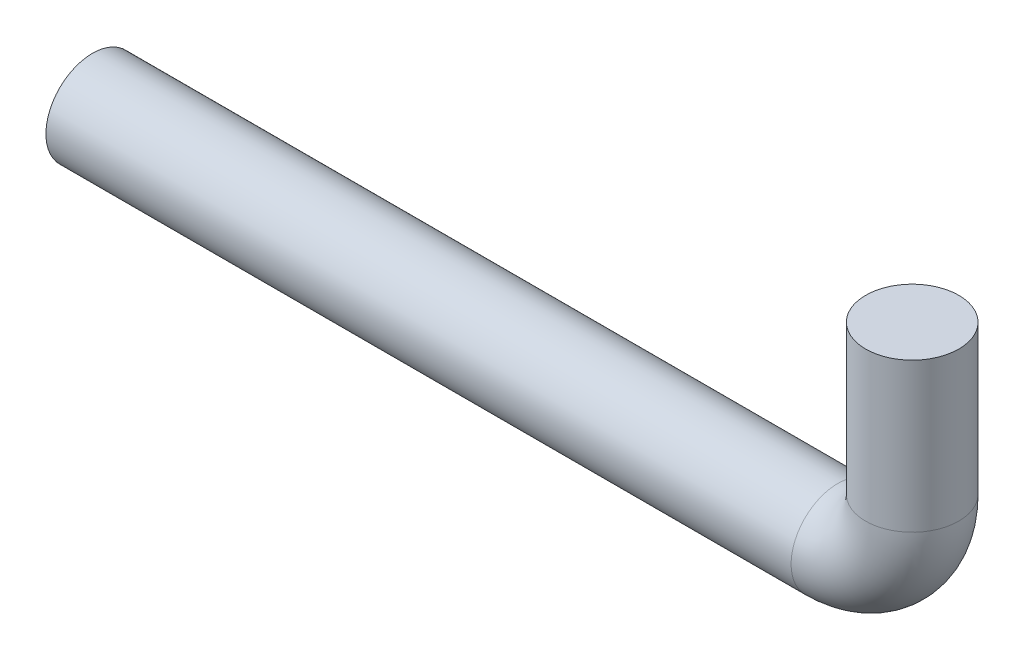
ISO-10303-21;
HEADER;
FILE_DESCRIPTION(('STEP AP214'),'2;1');
FILE_NAME('part.step','',(''),(''),'','','');
FILE_SCHEMA(('AUTOMOTIVE_DESIGN { 1 0 10303 214 1 1 1 1 }'));
ENDSEC;
DATA;
#1=APPLICATION_CONTEXT('core data for automotive mechanical design processes');
#2=APPLICATION_PROTOCOL_DEFINITION('international standard','automotive_design',2000,#1);
#3=PRODUCT_CONTEXT('',#1,'mechanical');
#4=PRODUCT('Part','Part','',(#3));
#5=PRODUCT_RELATED_PRODUCT_CATEGORY('part','',(#4));
#6=PRODUCT_DEFINITION_FORMATION('','',#4);
#7=PRODUCT_DEFINITION_CONTEXT('part definition',#1,'design');
#8=PRODUCT_DEFINITION('design','',#6,#7);
#9=PRODUCT_DEFINITION_SHAPE('','',#8);
#10=(LENGTH_UNIT() NAMED_UNIT(*) SI_UNIT(.MILLI.,.METRE.));
#11=(NAMED_UNIT(*) PLANE_ANGLE_UNIT() SI_UNIT($,.RADIAN.));
#12=(NAMED_UNIT(*) SI_UNIT($,.STERADIAN.) SOLID_ANGLE_UNIT());
#13=UNCERTAINTY_MEASURE_WITH_UNIT(LENGTH_MEASURE(1.E-05),#10,'distance_accuracy_value','');
#14=(GEOMETRIC_REPRESENTATION_CONTEXT(3) GLOBAL_UNCERTAINTY_ASSIGNED_CONTEXT((#13)) GLOBAL_UNIT_ASSIGNED_CONTEXT((#10,
#11,#12)) REPRESENTATION_CONTEXT('',''));
#15=CARTESIAN_POINT('',(0.,0.,0.));
#16=DIRECTION('',(0.,0.,1.));
#17=DIRECTION('',(1.,0.,0.));
#18=AXIS2_PLACEMENT_3D('',#15,#16,#17);
#19=CARTESIAN_POINT('',(0.,0.,0.));
#20=DIRECTION('',(1.,0.,0.));
#21=DIRECTION('',(0.,0.,-1.));
#22=AXIS2_PLACEMENT_3D('',#19,#20,#21);
#23=PLANE('',#22);
#24=CARTESIAN_POINT('',(0.,0.,0.));
#25=DIRECTION('',(1.,0.,0.));
#26=DIRECTION('',(0.,0.,-1.));
#27=AXIS2_PLACEMENT_3D('',#24,#25,#26);
#28=CIRCLE('',#27,0.79375);
#29=CARTESIAN_POINT('',(0.,0.,-0.79375));
#30=VERTEX_POINT('',#29);
#31=EDGE_CURVE('E45',#30,#30,#28,.T.);
#32=ORIENTED_EDGE('',*,*,#31,.F.);
#33=EDGE_LOOP('',(#32));
#34=FACE_BOUND('',#33,.T.);
#35=ADVANCED_FACE('F33',(#34),#23,.F.);
#36=CARTESIAN_POINT('',(13.97,3.81,0.));
#37=DIRECTION('',(0.,1.,0.));
#38=DIRECTION('',(0.,0.,-1.));
#39=AXIS2_PLACEMENT_3D('',#36,#37,#38);
#40=PLANE('',#39);
#41=CARTESIAN_POINT('',(13.97,3.81,0.));
#42=DIRECTION('',(0.,1.,0.));
#43=DIRECTION('',(0.,0.,-1.));
#44=AXIS2_PLACEMENT_3D('',#41,#42,#43);
#45=CIRCLE('',#44,0.79375);
#46=CARTESIAN_POINT('',(13.97,3.81,-0.79375));
#47=VERTEX_POINT('',#46);
#48=EDGE_CURVE('E11',#47,#47,#45,.T.);
#49=ORIENTED_EDGE('',*,*,#48,.T.);
#50=EDGE_LOOP('',(#49));
#51=FACE_BOUND('',#50,.T.);
#52=ADVANCED_FACE('F48',(#51),#40,.T.);
#53=CARTESIAN_POINT('',(0.,0.,0.));
#54=DIRECTION('',(1.,0.,0.));
#55=DIRECTION('',(0.,0.,-1.));
#56=AXIS2_PLACEMENT_3D('',#53,#54,#55);
#57=CYLINDRICAL_SURFACE('',#56,0.79375);
#58=CARTESIAN_POINT('',(12.7,0.,0.));
#59=DIRECTION('',(1.,0.,0.));
#60=DIRECTION('',(0.,0.,-1.));
#61=AXIS2_PLACEMENT_3D('',#58,#59,#60);
#62=CIRCLE('',#61,0.79375);
#63=CARTESIAN_POINT('',(12.7,-0.79375,0.));
#64=VERTEX_POINT('',#63);
#65=EDGE_CURVE('E58',#64,#64,#62,.T.);
#66=ORIENTED_EDGE('',*,*,#65,.F.);
#67=EDGE_LOOP('',(#66));
#68=FACE_BOUND('',#67,.T.);
#69=ORIENTED_EDGE('',*,*,#31,.T.);
#70=EDGE_LOOP('',(#69));
#71=FACE_BOUND('',#70,.T.);
#72=ADVANCED_FACE('F63',(#68,#71),#57,.T.);
#73=CARTESIAN_POINT('',(12.7,1.27,0.));
#74=DIRECTION('',(0.,0.,1.));
#75=DIRECTION('',(1.,0.,0.));
#76=AXIS2_PLACEMENT_3D('',#73,#74,#75);
#77=TOROIDAL_SURFACE('',#76,1.27,0.79375);
#78=CARTESIAN_POINT('',(13.97,1.27,0.));
#79=DIRECTION('',(0.,1.,0.));
#80=DIRECTION('',(0.,0.,-1.));
#81=AXIS2_PLACEMENT_3D('',#78,#79,#80);
#82=CIRCLE('',#81,0.79375);
#83=CARTESIAN_POINT('',(14.76375,1.27,0.));
#84=VERTEX_POINT('',#83);
#85=EDGE_CURVE('E40',#84,#84,#82,.T.);
#86=CARTESIAN_POINT('',(12.7,1.27,0.));
#87=DIRECTION('',(0.,0.,1.));
#88=DIRECTION('',(1.,0.,0.));
#89=AXIS2_PLACEMENT_3D('',#86,#87,#88);
#90=CIRCLE('',#89,2.06375);
#91=EDGE_CURVE('',#64,#84,#90,.T.);
#92=ORIENTED_EDGE('',*,*,#65,.T.);
#93=ORIENTED_EDGE('',*,*,#85,.F.);
#94=ORIENTED_EDGE('',*,*,#91,.T.);
#95=ORIENTED_EDGE('',*,*,#91,.F.);
#96=EDGE_LOOP('',(#92,#94,#93,#95));
#97=FACE_BOUND('',#96,.T.);
#98=ADVANCED_FACE('F53',(#97),#77,.T.);
#99=CARTESIAN_POINT('',(13.97,1.27,0.));
#100=DIRECTION('',(0.,1.,0.));
#101=DIRECTION('',(0.,0.,1.));
#102=AXIS2_PLACEMENT_3D('',#99,#100,#101);
#103=CYLINDRICAL_SURFACE('',#102,0.79375);
#104=ORIENTED_EDGE('',*,*,#48,.F.);
#105=EDGE_LOOP('',(#104));
#106=FACE_BOUND('',#105,.T.);
#107=ORIENTED_EDGE('',*,*,#85,.T.);
#108=EDGE_LOOP('',(#107));
#109=FACE_BOUND('',#108,.T.);
#110=ADVANCED_FACE('F50',(#106,#109),#103,.T.);
#111=CLOSED_SHELL('',(#35,#52,#72,#98,#110));
#112=MANIFOLD_SOLID_BREP('B2',#111);
#113=ADVANCED_BREP_SHAPE_REPRESENTATION('',(#18,#112),#14);
#114=SHAPE_DEFINITION_REPRESENTATION(#9,#113);
ENDSEC;
END-ISO-10303-21;
